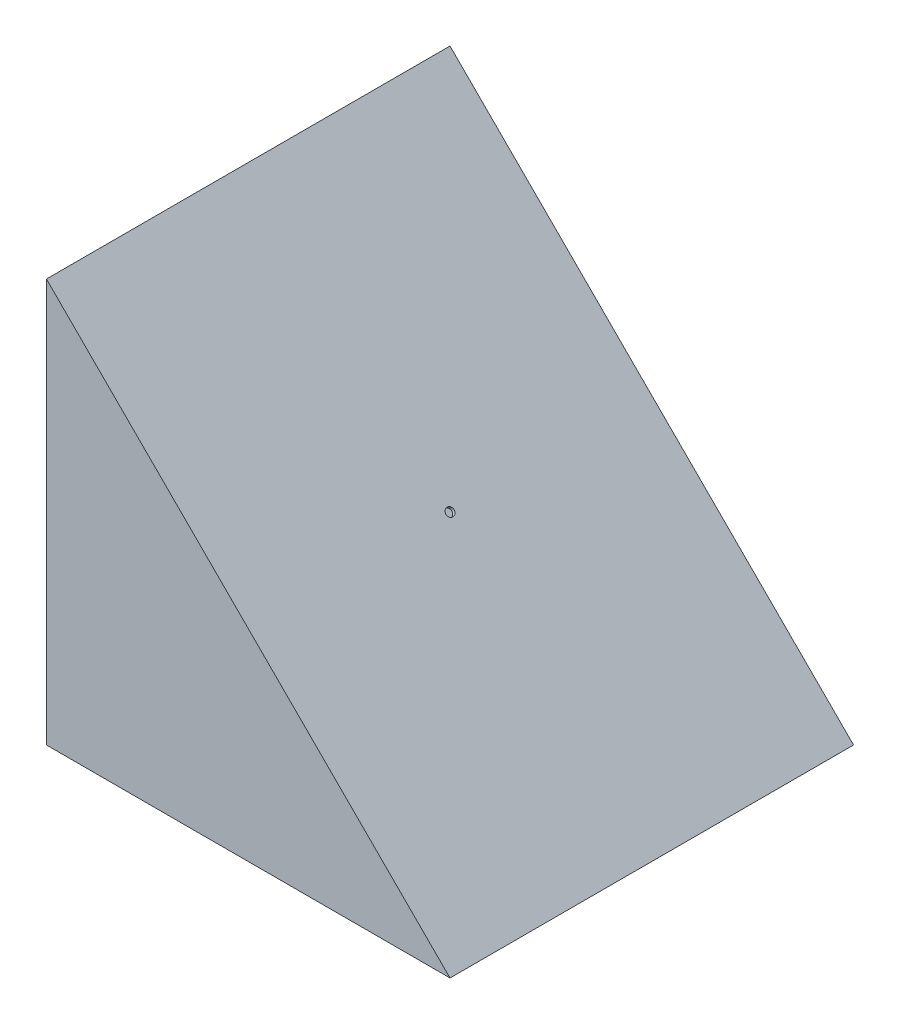
ISO-10303-21;
HEADER;
FILE_DESCRIPTION(('STEP AP214'),'2;1');
FILE_NAME('part.step','',(''),(''),'','','');
FILE_SCHEMA(('AUTOMOTIVE_DESIGN { 1 0 10303 214 1 1 1 1 }'));
ENDSEC;
DATA;
#1=APPLICATION_CONTEXT('core data for automotive mechanical design processes');
#2=APPLICATION_PROTOCOL_DEFINITION('international standard','automotive_design',2000,#1);
#3=PRODUCT_CONTEXT('',#1,'mechanical');
#4=PRODUCT('Part','Part','',(#3));
#5=PRODUCT_RELATED_PRODUCT_CATEGORY('part','',(#4));
#6=PRODUCT_DEFINITION_FORMATION('','',#4);
#7=PRODUCT_DEFINITION_CONTEXT('part definition',#1,'design');
#8=PRODUCT_DEFINITION('design','',#6,#7);
#9=PRODUCT_DEFINITION_SHAPE('','',#8);
#10=(LENGTH_UNIT() NAMED_UNIT(*) SI_UNIT(.MILLI.,.METRE.));
#11=(NAMED_UNIT(*) PLANE_ANGLE_UNIT() SI_UNIT($,.RADIAN.));
#12=(NAMED_UNIT(*) SI_UNIT($,.STERADIAN.) SOLID_ANGLE_UNIT());
#13=UNCERTAINTY_MEASURE_WITH_UNIT(LENGTH_MEASURE(1.E-05),#10,'distance_accuracy_value','');
#14=(GEOMETRIC_REPRESENTATION_CONTEXT(3) GLOBAL_UNCERTAINTY_ASSIGNED_CONTEXT((#13)) GLOBAL_UNIT_ASSIGNED_CONTEXT((#10,
#11,#12)) REPRESENTATION_CONTEXT('',''));
#15=CARTESIAN_POINT('',(0.,0.,0.));
#16=DIRECTION('',(0.,0.,1.));
#17=DIRECTION('',(1.,0.,0.));
#18=AXIS2_PLACEMENT_3D('',#15,#16,#17);
#19=CARTESIAN_POINT('',(0.,0.,50.));
#20=DIRECTION('',(0.,1.,0.));
#21=DIRECTION('',(0.,0.,1.));
#22=AXIS2_PLACEMENT_3D('',#19,#20,#21);
#23=PLANE('',#22);
#24=DIRECTION('',(1.,0.,0.));
#25=VECTOR('',#24,1.);
#26=CARTESIAN_POINT('',(0.,0.,0.));
#27=LINE('',#26,#25);
#28=CARTESIAN_POINT('',(0.,0.,0.));
#29=VERTEX_POINT('',#28);
#30=CARTESIAN_POINT('',(50.,0.,0.));
#31=VERTEX_POINT('',#30);
#32=EDGE_CURVE('E233',#29,#31,#27,.T.);
#33=ORIENTED_EDGE('',*,*,#32,.T.);
#34=DIRECTION('',(0.,0.,-1.));
#35=VECTOR('',#34,1.);
#36=CARTESIAN_POINT('',(50.,0.,50.));
#37=LINE('',#36,#35);
#38=CARTESIAN_POINT('',(50.,0.,50.));
#39=VERTEX_POINT('',#38);
#40=EDGE_CURVE('E11',#39,#31,#37,.T.);
#41=ORIENTED_EDGE('',*,*,#40,.F.);
#42=DIRECTION('',(1.,0.,0.));
#43=VECTOR('',#42,1.);
#44=CARTESIAN_POINT('',(0.,0.,50.));
#45=LINE('',#44,#43);
#46=CARTESIAN_POINT('',(0.,0.,50.));
#47=VERTEX_POINT('',#46);
#48=EDGE_CURVE('E253',#47,#39,#45,.T.);
#49=ORIENTED_EDGE('',*,*,#48,.F.);
#50=DIRECTION('',(0.,0.,-1.));
#51=VECTOR('',#50,1.);
#52=CARTESIAN_POINT('',(0.,0.,50.));
#53=LINE('',#52,#51);
#54=EDGE_CURVE('E257',#47,#29,#53,.T.);
#55=ORIENTED_EDGE('',*,*,#54,.T.);
#56=EDGE_LOOP('',(#33,#41,#49,#55));
#57=FACE_BOUND('',#56,.T.);
#58=DIRECTION('',(0.,0.,1.));
#59=VECTOR('',#58,1.);
#60=CARTESIAN_POINT('',(22.4,0.,0.));
#61=LINE('',#60,#59);
#62=CARTESIAN_POINT('',(22.4,0.,27.6));
#63=VERTEX_POINT('',#62);
#64=CARTESIAN_POINT('',(22.4,0.,30.1));
#65=VERTEX_POINT('',#64);
#66=EDGE_CURVE('E47',#63,#65,#61,.T.);
#67=ORIENTED_EDGE('',*,*,#66,.T.);
#68=DIRECTION('',(1.,0.,0.));
#69=VECTOR('',#68,1.);
#70=CARTESIAN_POINT('',(0.,0.,30.1));
#71=LINE('',#70,#69);
#72=CARTESIAN_POINT('',(27.6,0.,30.1));
#73=VERTEX_POINT('',#72);
#74=EDGE_CURVE('E169',#65,#73,#71,.T.);
#75=ORIENTED_EDGE('',*,*,#74,.T.);
#76=DIRECTION('',(0.,0.,1.));
#77=VECTOR('',#76,1.);
#78=CARTESIAN_POINT('',(27.6,0.,0.));
#79=LINE('',#78,#77);
#80=CARTESIAN_POINT('',(27.6,0.,27.6));
#81=VERTEX_POINT('',#80);
#82=EDGE_CURVE('E172',#81,#73,#79,.T.);
#83=ORIENTED_EDGE('',*,*,#82,.F.);
#84=DIRECTION('',(1.,0.,0.));
#85=VECTOR('',#84,1.);
#86=CARTESIAN_POINT('',(0.,0.,27.6));
#87=LINE('',#86,#85);
#88=CARTESIAN_POINT('',(30.1,0.,27.6));
#89=VERTEX_POINT('',#88);
#90=EDGE_CURVE('E226',#81,#89,#87,.T.);
#91=ORIENTED_EDGE('',*,*,#90,.T.);
#92=DIRECTION('',(0.,0.,1.));
#93=VECTOR('',#92,1.);
#94=CARTESIAN_POINT('',(30.1,0.,0.));
#95=LINE('',#94,#93);
#96=CARTESIAN_POINT('',(30.1,0.,22.4));
#97=VERTEX_POINT('',#96);
#98=EDGE_CURVE('E223',#97,#89,#95,.T.);
#99=ORIENTED_EDGE('',*,*,#98,.F.);
#100=DIRECTION('',(1.,0.,0.));
#101=VECTOR('',#100,1.);
#102=CARTESIAN_POINT('',(0.,0.,22.4));
#103=LINE('',#102,#101);
#104=CARTESIAN_POINT('',(27.6,0.,22.4));
#105=VERTEX_POINT('',#104);
#106=EDGE_CURVE('E220',#105,#97,#103,.T.);
#107=ORIENTED_EDGE('',*,*,#106,.F.);
#108=DIRECTION('',(0.,0.,1.));
#109=VECTOR('',#108,1.);
#110=CARTESIAN_POINT('',(27.6,0.,0.));
#111=LINE('',#110,#109);
#112=CARTESIAN_POINT('',(27.6,0.,19.9));
#113=VERTEX_POINT('',#112);
#114=EDGE_CURVE('E217',#113,#105,#111,.T.);
#115=ORIENTED_EDGE('',*,*,#114,.F.);
#116=DIRECTION('',(1.,0.,0.));
#117=VECTOR('',#116,1.);
#118=CARTESIAN_POINT('',(0.,0.,19.9));
#119=LINE('',#118,#117);
#120=CARTESIAN_POINT('',(22.4,0.,19.9));
#121=VERTEX_POINT('',#120);
#122=EDGE_CURVE('E214',#121,#113,#119,.T.);
#123=ORIENTED_EDGE('',*,*,#122,.F.);
#124=DIRECTION('',(0.,0.,1.));
#125=VECTOR('',#124,1.);
#126=CARTESIAN_POINT('',(22.4,0.,0.));
#127=LINE('',#126,#125);
#128=CARTESIAN_POINT('',(22.4,0.,22.4));
#129=VERTEX_POINT('',#128);
#130=EDGE_CURVE('E211',#121,#129,#127,.T.);
#131=ORIENTED_EDGE('',*,*,#130,.T.);
#132=DIRECTION('',(1.,0.,0.));
#133=VECTOR('',#132,1.);
#134=CARTESIAN_POINT('',(0.,0.,22.4));
#135=LINE('',#134,#133);
#136=CARTESIAN_POINT('',(19.9,0.,22.4));
#137=VERTEX_POINT('',#136);
#138=EDGE_CURVE('E208',#137,#129,#135,.T.);
#139=ORIENTED_EDGE('',*,*,#138,.F.);
#140=DIRECTION('',(0.,0.,1.));
#141=VECTOR('',#140,1.);
#142=CARTESIAN_POINT('',(19.9,0.,0.));
#143=LINE('',#142,#141);
#144=CARTESIAN_POINT('',(19.9,0.,27.6));
#145=VERTEX_POINT('',#144);
#146=EDGE_CURVE('E205',#137,#145,#143,.T.);
#147=ORIENTED_EDGE('',*,*,#146,.T.);
#148=DIRECTION('',(1.,0.,0.));
#149=VECTOR('',#148,1.);
#150=CARTESIAN_POINT('',(0.,0.,27.6));
#151=LINE('',#150,#149);
#152=EDGE_CURVE('E202',#145,#63,#151,.T.);
#153=ORIENTED_EDGE('',*,*,#152,.T.);
#154=EDGE_LOOP('',(#67,#75,#83,#91,#99,#107,#115,#123,#131,#139,#147,#153));
#155=FACE_BOUND('',#154,.T.);
#156=ADVANCED_FACE('F33',(#57,#155),#23,.F.);
#157=CARTESIAN_POINT('',(0.,50.0000000000002,50.));
#158=DIRECTION('',(-0.707106781186549,-0.707106781186546,0.));
#159=DIRECTION('',(0.707106781186546,-0.707106781186549,0.));
#160=AXIS2_PLACEMENT_3D('',#157,#158,#159);
#161=PLANE('',#160);
#162=CARTESIAN_POINT('',(25.0000000000001,25.,25.));
#163=DIRECTION('',(0.707106781186549,0.707106781186546,0.));
#164=DIRECTION('',(-0.707106781186546,0.707106781186549,0.));
#165=AXIS2_PLACEMENT_3D('',#162,#163,#164);
#166=CIRCLE('',#165,0.499999999999999);
#167=CARTESIAN_POINT('',(24.6464466094068,25.3535533905933,25.));
#168=VERTEX_POINT('',#167);
#169=EDGE_CURVE('E175',#168,#168,#166,.T.);
#170=ORIENTED_EDGE('',*,*,#169,.F.);
#171=EDGE_LOOP('',(#170));
#172=FACE_BOUND('',#171,.T.);
#173=DIRECTION('',(-0.707106781186546,0.707106781186549,0.));
#174=VECTOR('',#173,1.);
#175=CARTESIAN_POINT('',(0.,50.0000000000002,0.));
#176=LINE('',#175,#174);
#177=CARTESIAN_POINT('',(0.,50.0000000000002,0.));
#178=VERTEX_POINT('',#177);
#179=EDGE_CURVE('E260',#31,#178,#176,.T.);
#180=ORIENTED_EDGE('',*,*,#179,.T.);
#181=DIRECTION('',(0.,0.,-1.));
#182=VECTOR('',#181,1.);
#183=CARTESIAN_POINT('',(0.,50.0000000000002,50.));
#184=LINE('',#183,#182);
#185=CARTESIAN_POINT('',(0.,50.0000000000002,50.));
#186=VERTEX_POINT('',#185);
#187=EDGE_CURVE('E40',#186,#178,#184,.T.);
#188=ORIENTED_EDGE('',*,*,#187,.F.);
#189=DIRECTION('',(-0.707106781186546,0.707106781186549,0.));
#190=VECTOR('',#189,1.);
#191=CARTESIAN_POINT('',(0.,50.0000000000002,50.));
#192=LINE('',#191,#190);
#193=EDGE_CURVE('E78',#39,#186,#192,.T.);
#194=ORIENTED_EDGE('',*,*,#193,.F.);
#195=ORIENTED_EDGE('',*,*,#40,.T.);
#196=EDGE_LOOP('',(#180,#188,#194,#195));
#197=FACE_BOUND('',#196,.T.);
#198=ADVANCED_FACE('F279',(#172,#197),#161,.F.);
#199=CARTESIAN_POINT('',(0.,0.,50.));
#200=DIRECTION('',(1.,0.,0.));
#201=DIRECTION('',(0.,1.,0.));
#202=AXIS2_PLACEMENT_3D('',#199,#200,#201);
#203=PLANE('',#202);
#204=DIRECTION('',(0.,-1.,0.));
#205=VECTOR('',#204,1.);
#206=CARTESIAN_POINT('',(0.,0.,0.));
#207=LINE('',#206,#205);
#208=EDGE_CURVE('E73',#178,#29,#207,.T.);
#209=ORIENTED_EDGE('',*,*,#208,.T.);
#210=ORIENTED_EDGE('',*,*,#54,.F.);
#211=DIRECTION('',(0.,-1.,0.));
#212=VECTOR('',#211,1.);
#213=CARTESIAN_POINT('',(0.,0.,50.));
#214=LINE('',#213,#212);
#215=EDGE_CURVE('E56',#186,#47,#214,.T.);
#216=ORIENTED_EDGE('',*,*,#215,.F.);
#217=ORIENTED_EDGE('',*,*,#187,.T.);
#218=EDGE_LOOP('',(#209,#210,#216,#217));
#219=FACE_BOUND('',#218,.T.);
#220=ADVANCED_FACE('F263',(#219),#203,.F.);
#221=CARTESIAN_POINT('',(0.,0.,50.));
#222=DIRECTION('',(0.,0.,1.));
#223=DIRECTION('',(1.,0.,0.));
#224=AXIS2_PLACEMENT_3D('',#221,#222,#223);
#225=PLANE('',#224);
#226=ORIENTED_EDGE('',*,*,#48,.T.);
#227=ORIENTED_EDGE('',*,*,#193,.T.);
#228=ORIENTED_EDGE('',*,*,#215,.T.);
#229=EDGE_LOOP('',(#226,#227,#228));
#230=FACE_BOUND('',#229,.T.);
#231=ADVANCED_FACE('F271',(#230),#225,.T.);
#232=CARTESIAN_POINT('',(0.,0.,0.));
#233=DIRECTION('',(0.,0.,1.));
#234=DIRECTION('',(1.,0.,0.));
#235=AXIS2_PLACEMENT_3D('',#232,#233,#234);
#236=PLANE('',#235);
#237=ORIENTED_EDGE('',*,*,#32,.F.);
#238=ORIENTED_EDGE('',*,*,#208,.F.);
#239=ORIENTED_EDGE('',*,*,#179,.F.);
#240=EDGE_LOOP('',(#237,#238,#239));
#241=FACE_BOUND('',#240,.T.);
#242=ADVANCED_FACE('F266',(#241),#236,.F.);
#243=CARTESIAN_POINT('',(22.4,6.,0.));
#244=DIRECTION('',(1.,0.,0.));
#245=DIRECTION('',(0.,0.,-1.));
#246=AXIS2_PLACEMENT_3D('',#243,#244,#245);
#247=PLANE('',#246);
#248=ORIENTED_EDGE('',*,*,#66,.F.);
#249=DIRECTION('',(0.,-1.,0.));
#250=VECTOR('',#249,1.);
#251=CARTESIAN_POINT('',(22.4,6.,27.6));
#252=LINE('',#251,#250);
#253=CARTESIAN_POINT('',(22.4,6.,27.6));
#254=VERTEX_POINT('',#253);
#255=EDGE_CURVE('E153',#254,#63,#252,.T.);
#256=ORIENTED_EDGE('',*,*,#255,.F.);
#257=DIRECTION('',(0.,0.,1.));
#258=VECTOR('',#257,1.);
#259=CARTESIAN_POINT('',(22.4,6.,0.));
#260=LINE('',#259,#258);
#261=CARTESIAN_POINT('',(22.4,6.,30.1));
#262=VERTEX_POINT('',#261);
#263=EDGE_CURVE('E160',#254,#262,#260,.T.);
#264=ORIENTED_EDGE('',*,*,#263,.T.);
#265=DIRECTION('',(0.,-1.,0.));
#266=VECTOR('',#265,1.);
#267=CARTESIAN_POINT('',(22.4,6.,30.1));
#268=LINE('',#267,#266);
#269=EDGE_CURVE('E231',#262,#65,#268,.T.);
#270=ORIENTED_EDGE('',*,*,#269,.T.);
#271=EDGE_LOOP('',(#248,#256,#264,#270));
#272=FACE_BOUND('',#271,.T.);
#273=ADVANCED_FACE('F163',(#272),#247,.T.);
#274=CARTESIAN_POINT('',(0.,6.,30.1));
#275=DIRECTION('',(0.,0.,-1.));
#276=DIRECTION('',(-1.,0.,0.));
#277=AXIS2_PLACEMENT_3D('',#274,#275,#276);
#278=PLANE('',#277);
#279=ORIENTED_EDGE('',*,*,#74,.F.);
#280=ORIENTED_EDGE('',*,*,#269,.F.);
#281=DIRECTION('',(1.,0.,0.));
#282=VECTOR('',#281,1.);
#283=CARTESIAN_POINT('',(0.,6.,30.1));
#284=LINE('',#283,#282);
#285=CARTESIAN_POINT('',(27.6,6.,30.1));
#286=VERTEX_POINT('',#285);
#287=EDGE_CURVE('E165',#262,#286,#284,.T.);
#288=ORIENTED_EDGE('',*,*,#287,.T.);
#289=DIRECTION('',(0.,-1.,0.));
#290=VECTOR('',#289,1.);
#291=CARTESIAN_POINT('',(27.6,6.,30.1));
#292=LINE('',#291,#290);
#293=EDGE_CURVE('E234',#286,#73,#292,.T.);
#294=ORIENTED_EDGE('',*,*,#293,.T.);
#295=EDGE_LOOP('',(#279,#280,#288,#294));
#296=FACE_BOUND('',#295,.T.);
#297=ADVANCED_FACE('F307',(#296),#278,.T.);
#298=CARTESIAN_POINT('',(27.6,6.,0.));
#299=DIRECTION('',(1.,0.,0.));
#300=DIRECTION('',(0.,0.,-1.));
#301=AXIS2_PLACEMENT_3D('',#298,#299,#300);
#302=PLANE('',#301);
#303=ORIENTED_EDGE('',*,*,#82,.T.);
#304=ORIENTED_EDGE('',*,*,#293,.F.);
#305=DIRECTION('',(0.,0.,1.));
#306=VECTOR('',#305,1.);
#307=CARTESIAN_POINT('',(27.6,6.,0.));
#308=LINE('',#307,#306);
#309=CARTESIAN_POINT('',(27.6,6.,27.6));
#310=VERTEX_POINT('',#309);
#311=EDGE_CURVE('E198',#310,#286,#308,.T.);
#312=ORIENTED_EDGE('',*,*,#311,.F.);
#313=DIRECTION('',(0.,-1.,0.));
#314=VECTOR('',#313,1.);
#315=CARTESIAN_POINT('',(27.6,6.,27.6));
#316=LINE('',#315,#314);
#317=EDGE_CURVE('E236',#310,#81,#316,.T.);
#318=ORIENTED_EDGE('',*,*,#317,.T.);
#319=EDGE_LOOP('',(#303,#304,#312,#318));
#320=FACE_BOUND('',#319,.T.);
#321=ADVANCED_FACE('F310',(#320),#302,.F.);
#322=CARTESIAN_POINT('',(0.,6.,27.6));
#323=DIRECTION('',(0.,0.,-1.));
#324=DIRECTION('',(-1.,0.,0.));
#325=AXIS2_PLACEMENT_3D('',#322,#323,#324);
#326=PLANE('',#325);
#327=ORIENTED_EDGE('',*,*,#90,.F.);
#328=ORIENTED_EDGE('',*,*,#317,.F.);
#329=DIRECTION('',(1.,0.,0.));
#330=VECTOR('',#329,1.);
#331=CARTESIAN_POINT('',(0.,6.,27.6));
#332=LINE('',#331,#330);
#333=CARTESIAN_POINT('',(30.1,6.,27.6));
#334=VERTEX_POINT('',#333);
#335=EDGE_CURVE('E196',#310,#334,#332,.T.);
#336=ORIENTED_EDGE('',*,*,#335,.T.);
#337=DIRECTION('',(0.,-1.,0.));
#338=VECTOR('',#337,1.);
#339=CARTESIAN_POINT('',(30.1,6.,27.6));
#340=LINE('',#339,#338);
#341=EDGE_CURVE('E238',#334,#89,#340,.T.);
#342=ORIENTED_EDGE('',*,*,#341,.T.);
#343=EDGE_LOOP('',(#327,#328,#336,#342));
#344=FACE_BOUND('',#343,.T.);
#345=ADVANCED_FACE('F314',(#344),#326,.T.);
#346=CARTESIAN_POINT('',(30.1,6.,0.));
#347=DIRECTION('',(1.,0.,0.));
#348=DIRECTION('',(0.,0.,-1.));
#349=AXIS2_PLACEMENT_3D('',#346,#347,#348);
#350=PLANE('',#349);
#351=ORIENTED_EDGE('',*,*,#98,.T.);
#352=ORIENTED_EDGE('',*,*,#341,.F.);
#353=DIRECTION('',(0.,0.,1.));
#354=VECTOR('',#353,1.);
#355=CARTESIAN_POINT('',(30.1,6.,0.));
#356=LINE('',#355,#354);
#357=CARTESIAN_POINT('',(30.1,6.,22.4));
#358=VERTEX_POINT('',#357);
#359=EDGE_CURVE('E193',#358,#334,#356,.T.);
#360=ORIENTED_EDGE('',*,*,#359,.F.);
#361=DIRECTION('',(0.,-1.,0.));
#362=VECTOR('',#361,1.);
#363=CARTESIAN_POINT('',(30.1,6.,22.4));
#364=LINE('',#363,#362);
#365=EDGE_CURVE('E240',#358,#97,#364,.T.);
#366=ORIENTED_EDGE('',*,*,#365,.T.);
#367=EDGE_LOOP('',(#351,#352,#360,#366));
#368=FACE_BOUND('',#367,.T.);
#369=ADVANCED_FACE('F318',(#368),#350,.F.);
#370=CARTESIAN_POINT('',(0.,6.,22.4));
#371=DIRECTION('',(0.,0.,-1.));
#372=DIRECTION('',(-1.,0.,0.));
#373=AXIS2_PLACEMENT_3D('',#370,#371,#372);
#374=PLANE('',#373);
#375=ORIENTED_EDGE('',*,*,#106,.T.);
#376=ORIENTED_EDGE('',*,*,#365,.F.);
#377=DIRECTION('',(1.,0.,0.));
#378=VECTOR('',#377,1.);
#379=CARTESIAN_POINT('',(0.,6.,22.4));
#380=LINE('',#379,#378);
#381=CARTESIAN_POINT('',(27.6,6.,22.4));
#382=VERTEX_POINT('',#381);
#383=EDGE_CURVE('E190',#382,#358,#380,.T.);
#384=ORIENTED_EDGE('',*,*,#383,.F.);
#385=DIRECTION('',(0.,-1.,0.));
#386=VECTOR('',#385,1.);
#387=CARTESIAN_POINT('',(27.6,6.,22.4));
#388=LINE('',#387,#386);
#389=EDGE_CURVE('E242',#382,#105,#388,.T.);
#390=ORIENTED_EDGE('',*,*,#389,.T.);
#391=EDGE_LOOP('',(#375,#376,#384,#390));
#392=FACE_BOUND('',#391,.T.);
#393=ADVANCED_FACE('F322',(#392),#374,.F.);
#394=CARTESIAN_POINT('',(27.6,6.,0.));
#395=DIRECTION('',(1.,0.,0.));
#396=DIRECTION('',(0.,0.,-1.));
#397=AXIS2_PLACEMENT_3D('',#394,#395,#396);
#398=PLANE('',#397);
#399=ORIENTED_EDGE('',*,*,#114,.T.);
#400=ORIENTED_EDGE('',*,*,#389,.F.);
#401=DIRECTION('',(0.,0.,1.));
#402=VECTOR('',#401,1.);
#403=CARTESIAN_POINT('',(27.6,6.,0.));
#404=LINE('',#403,#402);
#405=CARTESIAN_POINT('',(27.6,6.,19.9));
#406=VERTEX_POINT('',#405);
#407=EDGE_CURVE('E187',#406,#382,#404,.T.);
#408=ORIENTED_EDGE('',*,*,#407,.F.);
#409=DIRECTION('',(0.,-1.,0.));
#410=VECTOR('',#409,1.);
#411=CARTESIAN_POINT('',(27.6,6.,19.9));
#412=LINE('',#411,#410);
#413=EDGE_CURVE('E244',#406,#113,#412,.T.);
#414=ORIENTED_EDGE('',*,*,#413,.T.);
#415=EDGE_LOOP('',(#399,#400,#408,#414));
#416=FACE_BOUND('',#415,.T.);
#417=ADVANCED_FACE('F326',(#416),#398,.F.);
#418=CARTESIAN_POINT('',(0.,6.,19.9));
#419=DIRECTION('',(0.,0.,-1.));
#420=DIRECTION('',(-1.,0.,0.));
#421=AXIS2_PLACEMENT_3D('',#418,#419,#420);
#422=PLANE('',#421);
#423=ORIENTED_EDGE('',*,*,#122,.T.);
#424=ORIENTED_EDGE('',*,*,#413,.F.);
#425=DIRECTION('',(1.,0.,0.));
#426=VECTOR('',#425,1.);
#427=CARTESIAN_POINT('',(0.,6.,19.9));
#428=LINE('',#427,#426);
#429=CARTESIAN_POINT('',(22.4,6.,19.9));
#430=VERTEX_POINT('',#429);
#431=EDGE_CURVE('E184',#430,#406,#428,.T.);
#432=ORIENTED_EDGE('',*,*,#431,.F.);
#433=DIRECTION('',(0.,-1.,0.));
#434=VECTOR('',#433,1.);
#435=CARTESIAN_POINT('',(22.4,6.,19.9));
#436=LINE('',#435,#434);
#437=EDGE_CURVE('E246',#430,#121,#436,.T.);
#438=ORIENTED_EDGE('',*,*,#437,.T.);
#439=EDGE_LOOP('',(#423,#424,#432,#438));
#440=FACE_BOUND('',#439,.T.);
#441=ADVANCED_FACE('F330',(#440),#422,.F.);
#442=CARTESIAN_POINT('',(22.4,6.,0.));
#443=DIRECTION('',(1.,0.,0.));
#444=DIRECTION('',(0.,0.,-1.));
#445=AXIS2_PLACEMENT_3D('',#442,#443,#444);
#446=PLANE('',#445);
#447=ORIENTED_EDGE('',*,*,#130,.F.);
#448=ORIENTED_EDGE('',*,*,#437,.F.);
#449=DIRECTION('',(0.,0.,1.));
#450=VECTOR('',#449,1.);
#451=CARTESIAN_POINT('',(22.4,6.,0.));
#452=LINE('',#451,#450);
#453=CARTESIAN_POINT('',(22.4,6.,22.4));
#454=VERTEX_POINT('',#453);
#455=EDGE_CURVE('E182',#430,#454,#452,.T.);
#456=ORIENTED_EDGE('',*,*,#455,.T.);
#457=DIRECTION('',(0.,-1.,0.));
#458=VECTOR('',#457,1.);
#459=CARTESIAN_POINT('',(22.4,6.,22.4));
#460=LINE('',#459,#458);
#461=EDGE_CURVE('E248',#454,#129,#460,.T.);
#462=ORIENTED_EDGE('',*,*,#461,.T.);
#463=EDGE_LOOP('',(#447,#448,#456,#462));
#464=FACE_BOUND('',#463,.T.);
#465=ADVANCED_FACE('F334',(#464),#446,.T.);
#466=CARTESIAN_POINT('',(0.,6.,22.4));
#467=DIRECTION('',(0.,0.,-1.));
#468=DIRECTION('',(-1.,0.,0.));
#469=AXIS2_PLACEMENT_3D('',#466,#467,#468);
#470=PLANE('',#469);
#471=ORIENTED_EDGE('',*,*,#138,.T.);
#472=ORIENTED_EDGE('',*,*,#461,.F.);
#473=DIRECTION('',(1.,0.,0.));
#474=VECTOR('',#473,1.);
#475=CARTESIAN_POINT('',(0.,6.,22.4));
#476=LINE('',#475,#474);
#477=CARTESIAN_POINT('',(19.9,6.,22.4));
#478=VERTEX_POINT('',#477);
#479=EDGE_CURVE('E179',#478,#454,#476,.T.);
#480=ORIENTED_EDGE('',*,*,#479,.F.);
#481=DIRECTION('',(0.,-1.,0.));
#482=VECTOR('',#481,1.);
#483=CARTESIAN_POINT('',(19.9,6.,22.4));
#484=LINE('',#483,#482);
#485=EDGE_CURVE('E250',#478,#137,#484,.T.);
#486=ORIENTED_EDGE('',*,*,#485,.T.);
#487=EDGE_LOOP('',(#471,#472,#480,#486));
#488=FACE_BOUND('',#487,.T.);
#489=ADVANCED_FACE('F338',(#488),#470,.F.);
#490=CARTESIAN_POINT('',(19.9,6.,0.));
#491=DIRECTION('',(1.,0.,0.));
#492=DIRECTION('',(0.,0.,-1.));
#493=AXIS2_PLACEMENT_3D('',#490,#491,#492);
#494=PLANE('',#493);
#495=ORIENTED_EDGE('',*,*,#146,.F.);
#496=ORIENTED_EDGE('',*,*,#485,.F.);
#497=DIRECTION('',(0.,0.,1.));
#498=VECTOR('',#497,1.);
#499=CARTESIAN_POINT('',(19.9,6.,0.));
#500=LINE('',#499,#498);
#501=CARTESIAN_POINT('',(19.9,6.,27.6));
#502=VERTEX_POINT('',#501);
#503=EDGE_CURVE('E159',#478,#502,#500,.T.);
#504=ORIENTED_EDGE('',*,*,#503,.T.);
#505=DIRECTION('',(0.,-1.,0.));
#506=VECTOR('',#505,1.);
#507=CARTESIAN_POINT('',(19.9,6.,27.6));
#508=LINE('',#507,#506);
#509=EDGE_CURVE('E155',#502,#145,#508,.T.);
#510=ORIENTED_EDGE('',*,*,#509,.T.);
#511=EDGE_LOOP('',(#495,#496,#504,#510));
#512=FACE_BOUND('',#511,.T.);
#513=ADVANCED_FACE('F342',(#512),#494,.T.);
#514=CARTESIAN_POINT('',(0.,6.,27.6));
#515=DIRECTION('',(0.,0.,-1.));
#516=DIRECTION('',(-1.,0.,0.));
#517=AXIS2_PLACEMENT_3D('',#514,#515,#516);
#518=PLANE('',#517);
#519=ORIENTED_EDGE('',*,*,#152,.F.);
#520=ORIENTED_EDGE('',*,*,#509,.F.);
#521=DIRECTION('',(1.,0.,0.));
#522=VECTOR('',#521,1.);
#523=CARTESIAN_POINT('',(0.,6.,27.6));
#524=LINE('',#523,#522);
#525=EDGE_CURVE('E150',#502,#254,#524,.T.);
#526=ORIENTED_EDGE('',*,*,#525,.T.);
#527=ORIENTED_EDGE('',*,*,#255,.T.);
#528=EDGE_LOOP('',(#519,#520,#526,#527));
#529=FACE_BOUND('',#528,.T.);
#530=ADVANCED_FACE('F152',(#529),#518,.T.);
#531=CARTESIAN_POINT('',(0.,6.,0.));
#532=DIRECTION('',(0.,-1.,0.));
#533=DIRECTION('',(0.,0.,-1.));
#534=AXIS2_PLACEMENT_3D('',#531,#532,#533);
#535=PLANE('',#534);
#536=ORIENTED_EDGE('',*,*,#263,.F.);
#537=ORIENTED_EDGE('',*,*,#525,.F.);
#538=ORIENTED_EDGE('',*,*,#503,.F.);
#539=ORIENTED_EDGE('',*,*,#479,.T.);
#540=ORIENTED_EDGE('',*,*,#455,.F.);
#541=ORIENTED_EDGE('',*,*,#431,.T.);
#542=ORIENTED_EDGE('',*,*,#407,.T.);
#543=ORIENTED_EDGE('',*,*,#383,.T.);
#544=ORIENTED_EDGE('',*,*,#359,.T.);
#545=ORIENTED_EDGE('',*,*,#335,.F.);
#546=ORIENTED_EDGE('',*,*,#311,.T.);
#547=ORIENTED_EDGE('',*,*,#287,.F.);
#548=EDGE_LOOP('',(#536,#537,#538,#539,#540,#541,#542,#543,#544,#545,#546,#547));
#549=FACE_BOUND('',#548,.T.);
#550=ADVANCED_FACE('F167',(#549),#535,.T.);
#551=CARTESIAN_POINT('',(24.7171572875255,24.7171572875254,25.));
#552=DIRECTION('',(0.707106781186549,0.707106781186546,0.));
#553=DIRECTION('',(-0.707106781186546,0.707106781186549,0.));
#554=AXIS2_PLACEMENT_3D('',#551,#552,#553);
#555=CYLINDRICAL_SURFACE('',#554,0.499999999999999);
#556=CARTESIAN_POINT('',(24.7171572875255,24.7171572875254,25.));
#557=DIRECTION('',(0.707106781186549,0.707106781186546,0.));
#558=DIRECTION('',(-0.707106781186546,0.707106781186549,0.));
#559=AXIS2_PLACEMENT_3D('',#556,#557,#558);
#560=CIRCLE('',#559,0.499999999999999);
#561=CARTESIAN_POINT('',(24.3636038969322,25.0707106781187,25.));
#562=VERTEX_POINT('',#561);
#563=EDGE_CURVE('E203',#562,#562,#560,.T.);
#564=ORIENTED_EDGE('',*,*,#563,.F.);
#565=EDGE_LOOP('',(#564));
#566=FACE_BOUND('',#565,.T.);
#567=ORIENTED_EDGE('',*,*,#169,.T.);
#568=EDGE_LOOP('',(#567));
#569=FACE_BOUND('',#568,.T.);
#570=ADVANCED_FACE('F297',(#566,#569),#555,.F.);
#571=CARTESIAN_POINT('',(24.7171572875255,24.7171572875254,25.));
#572=DIRECTION('',(0.707106781186549,0.707106781186546,0.));
#573=DIRECTION('',(-0.707106781186546,0.707106781186549,0.));
#574=AXIS2_PLACEMENT_3D('',#571,#572,#573);
#575=PLANE('',#574);
#576=ORIENTED_EDGE('',*,*,#563,.T.);
#577=EDGE_LOOP('',(#576));
#578=FACE_BOUND('',#577,.T.);
#579=ADVANCED_FACE('F295',(#578),#575,.T.);
#580=CLOSED_SHELL('',(#156,#198,#220,#231,#242,#273,#297,#321,#345,#369,#393,#417,#441,#465,
#489,#513,#530,#550,#570,#579));
#581=MANIFOLD_SOLID_BREP('B2',#580);
#582=ADVANCED_BREP_SHAPE_REPRESENTATION('',(#18,#581),#14);
#583=SHAPE_DEFINITION_REPRESENTATION(#9,#582);
ENDSEC;
END-ISO-10303-21;
